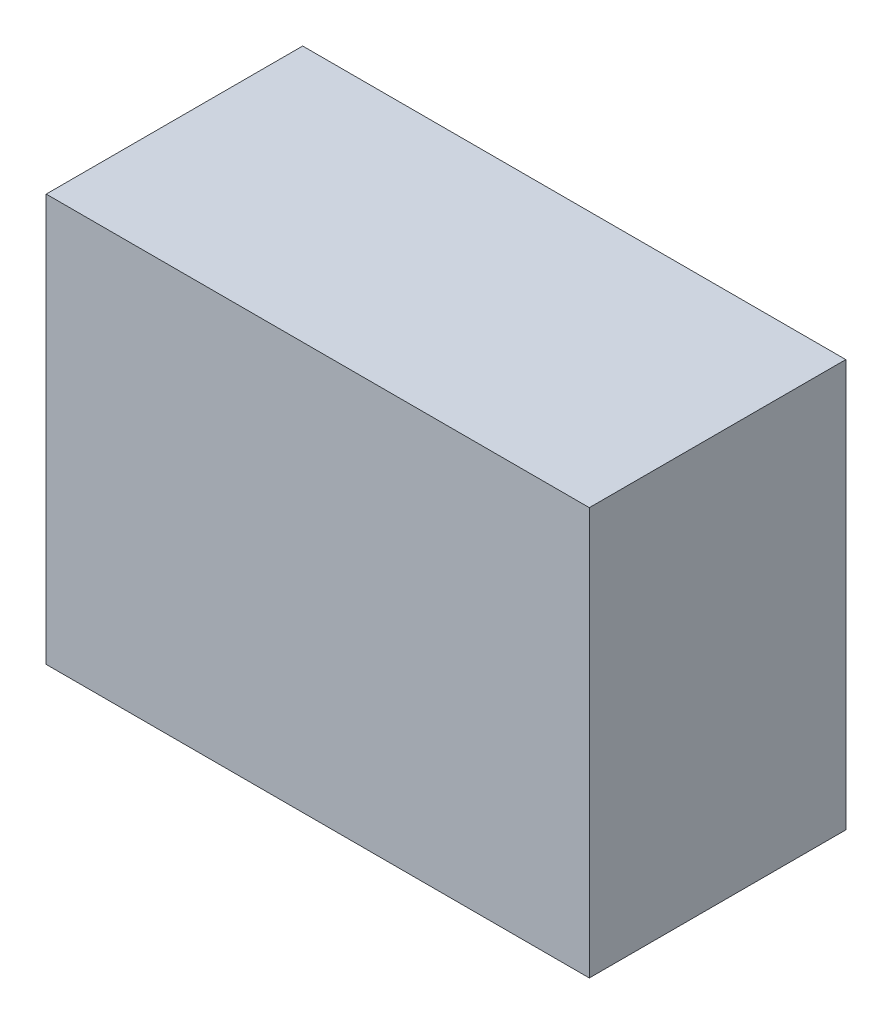
ISO-10303-21;
HEADER;
FILE_DESCRIPTION(('STEP AP214'),'2;1');
FILE_NAME('part.step','',(''),(''),'','','');
FILE_SCHEMA(('AUTOMOTIVE_DESIGN { 1 0 10303 214 1 1 1 1 }'));
ENDSEC;
DATA;
#1=APPLICATION_CONTEXT('core data for automotive mechanical design processes');
#2=APPLICATION_PROTOCOL_DEFINITION('international standard','automotive_design',2000,#1);
#3=PRODUCT_CONTEXT('',#1,'mechanical');
#4=PRODUCT('Part','Part','',(#3));
#5=PRODUCT_RELATED_PRODUCT_CATEGORY('part','',(#4));
#6=PRODUCT_DEFINITION_FORMATION('','',#4);
#7=PRODUCT_DEFINITION_CONTEXT('part definition',#1,'design');
#8=PRODUCT_DEFINITION('design','',#6,#7);
#9=PRODUCT_DEFINITION_SHAPE('','',#8);
#10=(LENGTH_UNIT() NAMED_UNIT(*) SI_UNIT(.MILLI.,.METRE.));
#11=(NAMED_UNIT(*) PLANE_ANGLE_UNIT() SI_UNIT($,.RADIAN.));
#12=(NAMED_UNIT(*) SI_UNIT($,.STERADIAN.) SOLID_ANGLE_UNIT());
#13=UNCERTAINTY_MEASURE_WITH_UNIT(LENGTH_MEASURE(1.E-05),#10,'distance_accuracy_value','');
#14=(GEOMETRIC_REPRESENTATION_CONTEXT(3) GLOBAL_UNCERTAINTY_ASSIGNED_CONTEXT((#13)) GLOBAL_UNIT_ASSIGNED_CONTEXT((#10,
#11,#12)) REPRESENTATION_CONTEXT('',''));
#15=CARTESIAN_POINT('',(0.,0.,0.));
#16=DIRECTION('',(0.,0.,1.));
#17=DIRECTION('',(1.,0.,0.));
#18=AXIS2_PLACEMENT_3D('',#15,#16,#17);
#19=CARTESIAN_POINT('',(-36.,54.,17.));
#20=DIRECTION('',(1.,0.,0.));
#21=DIRECTION('',(0.,0.,-1.));
#22=AXIS2_PLACEMENT_3D('',#19,#20,#21);
#23=PLANE('',#22);
#24=DIRECTION('',(0.,0.,1.));
#25=VECTOR('',#24,1.);
#26=CARTESIAN_POINT('',(-36.,0.,17.));
#27=LINE('',#26,#25);
#28=CARTESIAN_POINT('',(-36.,0.,-17.));
#29=VERTEX_POINT('',#28);
#30=CARTESIAN_POINT('',(-36.,0.,17.));
#31=VERTEX_POINT('',#30);
#32=EDGE_CURVE('E102',#29,#31,#27,.T.);
#33=ORIENTED_EDGE('',*,*,#32,.T.);
#34=DIRECTION('',(0.,-1.,0.));
#35=VECTOR('',#34,1.);
#36=CARTESIAN_POINT('',(-36.,54.,17.));
#37=LINE('',#36,#35);
#38=CARTESIAN_POINT('',(-36.,54.,17.));
#39=VERTEX_POINT('',#38);
#40=EDGE_CURVE('E11',#39,#31,#37,.T.);
#41=ORIENTED_EDGE('',*,*,#40,.F.);
#42=DIRECTION('',(0.,0.,1.));
#43=VECTOR('',#42,1.);
#44=CARTESIAN_POINT('',(-36.,54.,17.));
#45=LINE('',#44,#43);
#46=CARTESIAN_POINT('',(-36.,54.,-17.));
#47=VERTEX_POINT('',#46);
#48=EDGE_CURVE('E90',#47,#39,#45,.T.);
#49=ORIENTED_EDGE('',*,*,#48,.F.);
#50=DIRECTION('',(0.,-1.,0.));
#51=VECTOR('',#50,1.);
#52=CARTESIAN_POINT('',(-36.,54.,-17.));
#53=LINE('',#52,#51);
#54=EDGE_CURVE('E98',#47,#29,#53,.T.);
#55=ORIENTED_EDGE('',*,*,#54,.T.);
#56=EDGE_LOOP('',(#33,#41,#49,#55));
#57=FACE_BOUND('',#56,.T.);
#58=ADVANCED_FACE('F39',(#57),#23,.F.);
#59=CARTESIAN_POINT('',(36.,54.,17.));
#60=DIRECTION('',(0.,0.,-1.));
#61=DIRECTION('',(-1.,0.,0.));
#62=AXIS2_PLACEMENT_3D('',#59,#60,#61);
#63=PLANE('',#62);
#64=DIRECTION('',(1.,0.,0.));
#65=VECTOR('',#64,1.);
#66=CARTESIAN_POINT('',(36.,0.,17.));
#67=LINE('',#66,#65);
#68=CARTESIAN_POINT('',(36.,0.,17.));
#69=VERTEX_POINT('',#68);
#70=EDGE_CURVE('E94',#31,#69,#67,.T.);
#71=ORIENTED_EDGE('',*,*,#70,.T.);
#72=DIRECTION('',(0.,-1.,0.));
#73=VECTOR('',#72,1.);
#74=CARTESIAN_POINT('',(36.,54.,17.));
#75=LINE('',#74,#73);
#76=CARTESIAN_POINT('',(36.,54.,17.));
#77=VERTEX_POINT('',#76);
#78=EDGE_CURVE('E47',#77,#69,#75,.T.);
#79=ORIENTED_EDGE('',*,*,#78,.F.);
#80=DIRECTION('',(1.,0.,0.));
#81=VECTOR('',#80,1.);
#82=CARTESIAN_POINT('',(36.,54.,17.));
#83=LINE('',#82,#81);
#84=EDGE_CURVE('E85',#39,#77,#83,.T.);
#85=ORIENTED_EDGE('',*,*,#84,.F.);
#86=ORIENTED_EDGE('',*,*,#40,.T.);
#87=EDGE_LOOP('',(#71,#79,#85,#86));
#88=FACE_BOUND('',#87,.T.);
#89=ADVANCED_FACE('F93',(#88),#63,.F.);
#90=CARTESIAN_POINT('',(36.,54.,17.));
#91=DIRECTION('',(-1.,0.,0.));
#92=DIRECTION('',(0.,0.,1.));
#93=AXIS2_PLACEMENT_3D('',#90,#91,#92);
#94=PLANE('',#93);
#95=DIRECTION('',(0.,0.,-1.));
#96=VECTOR('',#95,1.);
#97=CARTESIAN_POINT('',(36.,0.,17.));
#98=LINE('',#97,#96);
#99=CARTESIAN_POINT('',(36.,0.,-17.));
#100=VERTEX_POINT('',#99);
#101=EDGE_CURVE('E72',#69,#100,#98,.T.);
#102=ORIENTED_EDGE('',*,*,#101,.T.);
#103=DIRECTION('',(0.,-1.,0.));
#104=VECTOR('',#103,1.);
#105=CARTESIAN_POINT('',(36.,54.,-17.));
#106=LINE('',#105,#104);
#107=CARTESIAN_POINT('',(36.,54.,-17.));
#108=VERTEX_POINT('',#107);
#109=EDGE_CURVE('E95',#108,#100,#106,.T.);
#110=ORIENTED_EDGE('',*,*,#109,.F.);
#111=DIRECTION('',(0.,0.,-1.));
#112=VECTOR('',#111,1.);
#113=CARTESIAN_POINT('',(36.,54.,17.));
#114=LINE('',#113,#112);
#115=EDGE_CURVE('E88',#77,#108,#114,.T.);
#116=ORIENTED_EDGE('',*,*,#115,.F.);
#117=ORIENTED_EDGE('',*,*,#78,.T.);
#118=EDGE_LOOP('',(#102,#110,#116,#117));
#119=FACE_BOUND('',#118,.T.);
#120=ADVANCED_FACE('F96',(#119),#94,.F.);
#121=CARTESIAN_POINT('',(36.,54.,-17.));
#122=DIRECTION('',(0.,0.,1.));
#123=DIRECTION('',(1.,0.,0.));
#124=AXIS2_PLACEMENT_3D('',#121,#122,#123);
#125=PLANE('',#124);
#126=DIRECTION('',(-1.,0.,0.));
#127=VECTOR('',#126,1.);
#128=CARTESIAN_POINT('',(36.,0.,-17.));
#129=LINE('',#128,#127);
#130=EDGE_CURVE('E78',#100,#29,#129,.T.);
#131=ORIENTED_EDGE('',*,*,#130,.T.);
#132=ORIENTED_EDGE('',*,*,#54,.F.);
#133=DIRECTION('',(-1.,0.,0.));
#134=VECTOR('',#133,1.);
#135=CARTESIAN_POINT('',(36.,54.,-17.));
#136=LINE('',#135,#134);
#137=EDGE_CURVE('E55',#108,#47,#136,.T.);
#138=ORIENTED_EDGE('',*,*,#137,.F.);
#139=ORIENTED_EDGE('',*,*,#109,.T.);
#140=EDGE_LOOP('',(#131,#132,#138,#139));
#141=FACE_BOUND('',#140,.T.);
#142=ADVANCED_FACE('F109',(#141),#125,.F.);
#143=CARTESIAN_POINT('',(0.,54.,0.));
#144=DIRECTION('',(0.,1.,0.));
#145=DIRECTION('',(0.,0.,1.));
#146=AXIS2_PLACEMENT_3D('',#143,#144,#145);
#147=PLANE('',#146);
#148=ORIENTED_EDGE('',*,*,#48,.T.);
#149=ORIENTED_EDGE('',*,*,#84,.T.);
#150=ORIENTED_EDGE('',*,*,#115,.T.);
#151=ORIENTED_EDGE('',*,*,#137,.T.);
#152=EDGE_LOOP('',(#148,#149,#150,#151));
#153=FACE_BOUND('',#152,.T.);
#154=ADVANCED_FACE('F86',(#153),#147,.T.);
#155=CARTESIAN_POINT('',(0.,0.,0.));
#156=DIRECTION('',(0.,1.,0.));
#157=DIRECTION('',(0.,0.,1.));
#158=AXIS2_PLACEMENT_3D('',#155,#156,#157);
#159=PLANE('',#158);
#160=ORIENTED_EDGE('',*,*,#32,.F.);
#161=ORIENTED_EDGE('',*,*,#130,.F.);
#162=ORIENTED_EDGE('',*,*,#101,.F.);
#163=ORIENTED_EDGE('',*,*,#70,.F.);
#164=EDGE_LOOP('',(#160,#161,#162,#163));
#165=FACE_BOUND('',#164,.T.);
#166=ADVANCED_FACE('F112',(#165),#159,.F.);
#167=CLOSED_SHELL('',(#58,#89,#120,#142,#154,#166));
#168=MANIFOLD_SOLID_BREP('B2',#167);
#169=ADVANCED_BREP_SHAPE_REPRESENTATION('',(#18,#168),#14);
#170=SHAPE_DEFINITION_REPRESENTATION(#9,#169);
ENDSEC;
END-ISO-10303-21;
